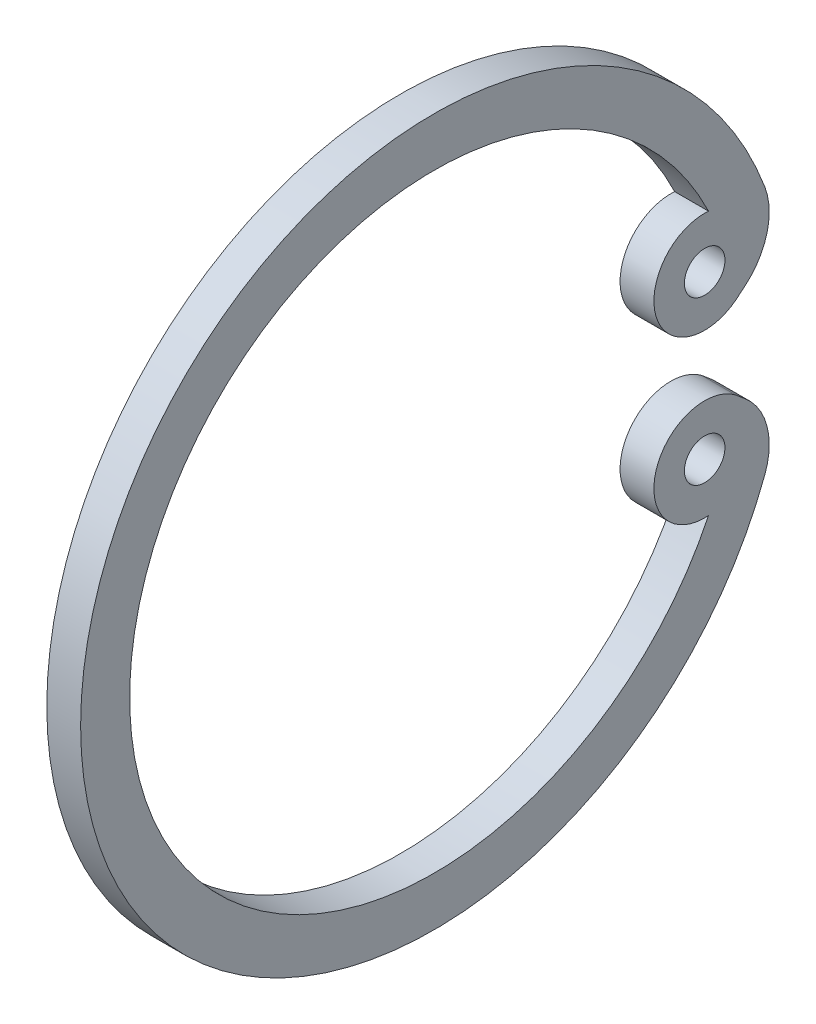
ISO-10303-21;
HEADER;
FILE_DESCRIPTION(('STEP AP214'),'2;1');
FILE_NAME('part.step','',(''),(''),'','','');
FILE_SCHEMA(('AUTOMOTIVE_DESIGN { 1 0 10303 214 1 1 1 1 }'));
ENDSEC;
DATA;
#1=APPLICATION_CONTEXT('core data for automotive mechanical design processes');
#2=APPLICATION_PROTOCOL_DEFINITION('international standard','automotive_design',2000,#1);
#3=PRODUCT_CONTEXT('',#1,'mechanical');
#4=PRODUCT('Part','Part','',(#3));
#5=PRODUCT_RELATED_PRODUCT_CATEGORY('part','',(#4));
#6=PRODUCT_DEFINITION_FORMATION('','',#4);
#7=PRODUCT_DEFINITION_CONTEXT('part definition',#1,'design');
#8=PRODUCT_DEFINITION('design','',#6,#7);
#9=PRODUCT_DEFINITION_SHAPE('','',#8);
#10=(LENGTH_UNIT() NAMED_UNIT(*) SI_UNIT(.MILLI.,.METRE.));
#11=(NAMED_UNIT(*) PLANE_ANGLE_UNIT() SI_UNIT($,.RADIAN.));
#12=(NAMED_UNIT(*) SI_UNIT($,.STERADIAN.) SOLID_ANGLE_UNIT());
#13=UNCERTAINTY_MEASURE_WITH_UNIT(LENGTH_MEASURE(1.E-05),#10,'distance_accuracy_value','');
#14=(GEOMETRIC_REPRESENTATION_CONTEXT(3) GLOBAL_UNCERTAINTY_ASSIGNED_CONTEXT((#13)) GLOBAL_UNIT_ASSIGNED_CONTEXT((#10,
#11,#12)) REPRESENTATION_CONTEXT('',''));
#15=CARTESIAN_POINT('',(0.,0.,0.));
#16=DIRECTION('',(0.,0.,1.));
#17=DIRECTION('',(1.,0.,0.));
#18=AXIS2_PLACEMENT_3D('',#15,#16,#17);
#19=CARTESIAN_POINT('',(18.3611111111111,-0.000162813210468626,9.93971753018335));
#20=DIRECTION('',(1.,0.,0.));
#21=DIRECTION('',(0.,0.,-1.));
#22=AXIS2_PLACEMENT_3D('',#19,#20,#21);
#23=CYLINDRICAL_SURFACE('',#22,2.5000000372529);
#24=CARTESIAN_POINT('',(18.6388888888889,-0.000162813210468626,9.93971753018335));
#25=DIRECTION('',(-1.,0.,0.));
#26=DIRECTION('',(0.,0.,1.));
#27=AXIS2_PLACEMENT_3D('',#24,#25,#26);
#28=CIRCLE('',#27,2.5000000372529);
#29=CARTESIAN_POINT('',(18.6388888888889,-1.08255334468496,7.68618010567962));
#30=VERTEX_POINT('',#29);
#31=CARTESIAN_POINT('',(18.6388888888889,1.08222771826402,7.68618010567962));
#32=VERTEX_POINT('',#31);
#33=EDGE_CURVE('E134',#30,#32,#28,.T.);
#34=ORIENTED_EDGE('',*,*,#33,.F.);
#35=DIRECTION('',(1.,0.,0.));
#36=VECTOR('',#35,1.);
#37=CARTESIAN_POINT('',(18.3611111111111,-1.08255334468496,7.68618010567962));
#38=LINE('',#37,#36);
#39=CARTESIAN_POINT('',(18.3611111111111,-1.08255334468496,7.68618010567962));
#40=VERTEX_POINT('',#39);
#41=EDGE_CURVE('E11',#40,#30,#38,.T.);
#42=ORIENTED_EDGE('',*,*,#41,.F.);
#43=CARTESIAN_POINT('',(18.3611111111111,-0.000162813210468626,9.93971753018335));
#44=DIRECTION('',(-1.,0.,0.));
#45=DIRECTION('',(0.,0.,1.));
#46=AXIS2_PLACEMENT_3D('',#43,#44,#45);
#47=CIRCLE('',#46,2.5000000372529);
#48=CARTESIAN_POINT('',(18.3611111111111,1.08222771826402,7.68618010567962));
#49=VERTEX_POINT('',#48);
#50=EDGE_CURVE('E155',#40,#49,#47,.T.);
#51=ORIENTED_EDGE('',*,*,#50,.T.);
#52=DIRECTION('',(1.,0.,0.));
#53=VECTOR('',#52,1.);
#54=CARTESIAN_POINT('',(18.3611111111111,1.08222771826402,7.68618010567962));
#55=LINE('',#54,#53);
#56=EDGE_CURVE('E40',#49,#32,#55,.T.);
#57=ORIENTED_EDGE('',*,*,#56,.T.);
#58=EDGE_LOOP('',(#34,#42,#51,#57));
#59=FACE_BOUND('',#58,.T.);
#60=ADVANCED_FACE('F37',(#59),#23,.F.);
#61=CARTESIAN_POINT('',(18.3611111111111,-0.666917459563021,7.71771885059295));
#62=DIRECTION('',(1.,0.,0.));
#63=DIRECTION('',(0.,0.,-1.));
#64=AXIS2_PLACEMENT_3D('',#61,#62,#63);
#65=CYLINDRICAL_SURFACE('',#64,0.416830758740048);
#66=CARTESIAN_POINT('',(18.6388888888889,-0.666917459563021,7.71771885059295));
#67=DIRECTION('',(1.,0.,0.));
#68=DIRECTION('',(0.,0.,-1.));
#69=AXIS2_PLACEMENT_3D('',#66,#67,#68);
#70=CIRCLE('',#69,0.416830758740048);
#71=CARTESIAN_POINT('',(18.6388888888889,-0.337229909778591,7.46266199232613));
#72=VERTEX_POINT('',#71);
#73=EDGE_CURVE('E153',#72,#30,#70,.T.);
#74=ORIENTED_EDGE('',*,*,#73,.F.);
#75=DIRECTION('',(1.,0.,0.));
#76=VECTOR('',#75,1.);
#77=CARTESIAN_POINT('',(18.3611111111111,-0.337229909778591,7.46266199232613));
#78=LINE('',#77,#76);
#79=CARTESIAN_POINT('',(18.3611111111111,-0.337229909778591,7.46266199232613));
#80=VERTEX_POINT('',#79);
#81=EDGE_CURVE('E46',#80,#72,#78,.T.);
#82=ORIENTED_EDGE('',*,*,#81,.F.);
#83=CARTESIAN_POINT('',(18.3611111111111,-0.666917459563021,7.71771885059295));
#84=DIRECTION('',(1.,0.,0.));
#85=DIRECTION('',(0.,0.,-1.));
#86=AXIS2_PLACEMENT_3D('',#83,#84,#85);
#87=CIRCLE('',#86,0.416830758740048);
#88=EDGE_CURVE('E124',#80,#40,#87,.T.);
#89=ORIENTED_EDGE('',*,*,#88,.T.);
#90=ORIENTED_EDGE('',*,*,#41,.T.);
#91=EDGE_LOOP('',(#74,#82,#89,#90));
#92=FACE_BOUND('',#91,.T.);
#93=ADVANCED_FACE('F167',(#92),#65,.T.);
#94=CARTESIAN_POINT('',(18.3611111111111,-0.401543008719923,7.38601662561192));
#95=DIRECTION('',(0.,0.766044443118982,-0.642787609686534));
#96=DIRECTION('',(0.,0.642787609686534,0.766044443118982));
#97=AXIS2_PLACEMENT_3D('',#94,#95,#96);
#98=PLANE('',#97);
#99=DIRECTION('',(0.,0.642787609686534,0.766044443118982));
#100=VECTOR('',#99,1.);
#101=CARTESIAN_POINT('',(18.6388888888889,-0.401543008719923,7.38601662561192));
#102=LINE('',#101,#100);
#103=CARTESIAN_POINT('',(18.6388888888889,-0.401543008719923,7.38601662561192));
#104=VERTEX_POINT('',#103);
#105=EDGE_CURVE('E111',#104,#72,#102,.T.);
#106=ORIENTED_EDGE('',*,*,#105,.F.);
#107=DIRECTION('',(1.,0.,0.));
#108=VECTOR('',#107,1.);
#109=CARTESIAN_POINT('',(18.3611111111111,-0.401543008719923,7.38601662561192));
#110=LINE('',#109,#108);
#111=CARTESIAN_POINT('',(18.3611111111111,-0.401543008719923,7.38601662561192));
#112=VERTEX_POINT('',#111);
#113=EDGE_CURVE('E106',#112,#104,#110,.T.);
#114=ORIENTED_EDGE('',*,*,#113,.F.);
#115=DIRECTION('',(0.,0.642787609686534,0.766044443118982));
#116=VECTOR('',#115,1.);
#117=CARTESIAN_POINT('',(18.3611111111111,-0.401543008719923,7.38601662561192));
#118=LINE('',#117,#116);
#119=EDGE_CURVE('E109',#112,#80,#118,.T.);
#120=ORIENTED_EDGE('',*,*,#119,.T.);
#121=ORIENTED_EDGE('',*,*,#81,.T.);
#122=EDGE_LOOP('',(#106,#114,#120,#121));
#123=FACE_BOUND('',#122,.T.);
#124=ADVANCED_FACE('F108',(#123),#98,.T.);
#125=CARTESIAN_POINT('',(18.3611111111111,-0.827123254897134,7.74312085321556));
#126=DIRECTION('',(1.,0.,0.));
#127=DIRECTION('',(0.,0.,-1.));
#128=AXIS2_PLACEMENT_3D('',#125,#126,#127);
#129=CYLINDRICAL_SURFACE('',#128,0.555555555555558);
#130=CARTESIAN_POINT('',(18.6388888888889,-0.827123254897134,7.74312085321556));
#131=DIRECTION('',(1.,0.,0.));
#132=DIRECTION('',(0.,0.,-1.));
#133=AXIS2_PLACEMENT_3D('',#130,#131,#132);
#134=CIRCLE('',#133,0.555555555555558);
#135=CARTESIAN_POINT('',(18.6388888888889,-1.02286333631576,7.22319028493276));
#136=VERTEX_POINT('',#135);
#137=EDGE_CURVE('E150',#136,#104,#134,.T.);
#138=ORIENTED_EDGE('',*,*,#137,.F.);
#139=DIRECTION('',(1.,0.,0.));
#140=VECTOR('',#139,1.);
#141=CARTESIAN_POINT('',(18.3611111111111,-1.02286333631576,7.22319028493276));
#142=LINE('',#141,#140);
#143=CARTESIAN_POINT('',(18.3611111111111,-1.02286333631576,7.22319028493276));
#144=VERTEX_POINT('',#143);
#145=EDGE_CURVE('E116',#144,#136,#142,.T.);
#146=ORIENTED_EDGE('',*,*,#145,.F.);
#147=CARTESIAN_POINT('',(18.3611111111111,-0.827123254897134,7.74312085321556));
#148=DIRECTION('',(1.,0.,0.));
#149=DIRECTION('',(0.,0.,-1.));
#150=AXIS2_PLACEMENT_3D('',#147,#148,#149);
#151=CIRCLE('',#150,0.555555555555558);
#152=EDGE_CURVE('E122',#144,#112,#151,.T.);
#153=ORIENTED_EDGE('',*,*,#152,.T.);
#154=ORIENTED_EDGE('',*,*,#113,.T.);
#155=EDGE_LOOP('',(#138,#146,#153,#154));
#156=FACE_BOUND('',#155,.T.);
#157=ADVANCED_FACE('F126',(#156),#129,.T.);
#158=CARTESIAN_POINT('',(18.3611111111111,-0.000162813210468626,9.93971753018335));
#159=DIRECTION('',(1.,0.,0.));
#160=DIRECTION('',(0.,0.,-1.));
#161=AXIS2_PLACEMENT_3D('',#158,#159,#160);
#162=CYLINDRICAL_SURFACE('',#161,2.90266026846901);
#163=CARTESIAN_POINT('',(18.6388888888889,-0.000162813210468626,9.93971753018335));
#164=DIRECTION('',(1.,0.,0.));
#165=DIRECTION('',(0.,0.,-1.));
#166=AXIS2_PLACEMENT_3D('',#163,#164,#165);
#167=CIRCLE('',#166,2.90266026846901);
#168=CARTESIAN_POINT('',(18.6388888888889,1.0225283518045,7.22318676187813));
#169=VERTEX_POINT('',#168);
#170=EDGE_CURVE('E147',#169,#136,#167,.T.);
#171=ORIENTED_EDGE('',*,*,#170,.F.);
#172=DIRECTION('',(1.,0.,0.));
#173=VECTOR('',#172,1.);
#174=CARTESIAN_POINT('',(18.3611111111111,1.0225283518045,7.22318676187813));
#175=LINE('',#174,#173);
#176=CARTESIAN_POINT('',(18.3611111111111,1.0225283518045,7.22318676187813));
#177=VERTEX_POINT('',#176);
#178=EDGE_CURVE('E159',#177,#169,#175,.T.);
#179=ORIENTED_EDGE('',*,*,#178,.F.);
#180=CARTESIAN_POINT('',(18.3611111111111,-0.000162813210468626,9.93971753018335));
#181=DIRECTION('',(1.,0.,0.));
#182=DIRECTION('',(0.,0.,-1.));
#183=AXIS2_PLACEMENT_3D('',#180,#181,#182);
#184=CIRCLE('',#183,2.90266026846901);
#185=EDGE_CURVE('E127',#177,#144,#184,.T.);
#186=ORIENTED_EDGE('',*,*,#185,.T.);
#187=ORIENTED_EDGE('',*,*,#145,.T.);
#188=EDGE_LOOP('',(#171,#179,#186,#187));
#189=FACE_BOUND('',#188,.T.);
#190=ADVANCED_FACE('F180',(#189),#162,.T.);
#191=CARTESIAN_POINT('',(18.3611111111111,0.826790061480457,7.74311800445706));
#192=DIRECTION('',(1.,0.,0.));
#193=DIRECTION('',(0.,0.,-1.));
#194=AXIS2_PLACEMENT_3D('',#191,#192,#193);
#195=CYLINDRICAL_SURFACE('',#194,0.555555555555555);
#196=CARTESIAN_POINT('',(18.6388888888889,0.826790061480457,7.74311800445706));
#197=DIRECTION('',(1.,0.,0.));
#198=DIRECTION('',(0.,0.,-1.));
#199=AXIS2_PLACEMENT_3D('',#196,#197,#198);
#200=CIRCLE('',#199,0.555555555555555);
#201=CARTESIAN_POINT('',(18.6388888888889,0.401209815303247,7.38601377685343));
#202=VERTEX_POINT('',#201);
#203=EDGE_CURVE('E144',#202,#169,#200,.T.);
#204=ORIENTED_EDGE('',*,*,#203,.F.);
#205=DIRECTION('',(1.,0.,0.));
#206=VECTOR('',#205,1.);
#207=CARTESIAN_POINT('',(18.3611111111111,0.401209815303247,7.38601377685343));
#208=LINE('',#207,#206);
#209=CARTESIAN_POINT('',(18.3611111111111,0.401209815303247,7.38601377685343));
#210=VERTEX_POINT('',#209);
#211=EDGE_CURVE('E161',#210,#202,#208,.T.);
#212=ORIENTED_EDGE('',*,*,#211,.F.);
#213=CARTESIAN_POINT('',(18.3611111111111,0.826790061480457,7.74311800445706));
#214=DIRECTION('',(1.,0.,0.));
#215=DIRECTION('',(0.,0.,-1.));
#216=AXIS2_PLACEMENT_3D('',#213,#214,#215);
#217=CIRCLE('',#216,0.555555555555555);
#218=EDGE_CURVE('E129',#210,#177,#217,.T.);
#219=ORIENTED_EDGE('',*,*,#218,.T.);
#220=ORIENTED_EDGE('',*,*,#178,.T.);
#221=EDGE_LOOP('',(#204,#212,#219,#220));
#222=FACE_BOUND('',#221,.T.);
#223=ADVANCED_FACE('F183',(#222),#195,.T.);
#224=CARTESIAN_POINT('',(18.3611111111111,0.337156289867929,7.46285995798236));
#225=DIRECTION('',(0.,-0.768147331821205,-0.640273126576435));
#226=DIRECTION('',(0.,0.640273126576435,-0.768147331821205));
#227=AXIS2_PLACEMENT_3D('',#224,#225,#226);
#228=PLANE('',#227);
#229=DIRECTION('',(0.,0.640273126576435,-0.768147331821205));
#230=VECTOR('',#229,1.);
#231=CARTESIAN_POINT('',(18.6388888888889,0.337156289867929,7.46285995798236));
#232=LINE('',#231,#230);
#233=CARTESIAN_POINT('',(18.6388888888889,0.337156289867929,7.46285995798236));
#234=VERTEX_POINT('',#233);
#235=EDGE_CURVE('E141',#234,#202,#232,.T.);
#236=ORIENTED_EDGE('',*,*,#235,.F.);
#237=DIRECTION('',(1.,0.,0.));
#238=VECTOR('',#237,1.);
#239=CARTESIAN_POINT('',(18.3611111111111,0.337156289867929,7.46285995798236));
#240=LINE('',#239,#238);
#241=CARTESIAN_POINT('',(18.3611111111111,0.337156289867929,7.46285995798236));
#242=VERTEX_POINT('',#241);
#243=EDGE_CURVE('E162',#242,#234,#240,.T.);
#244=ORIENTED_EDGE('',*,*,#243,.F.);
#245=DIRECTION('',(0.,0.640273126576435,-0.768147331821205));
#246=VECTOR('',#245,1.);
#247=CARTESIAN_POINT('',(18.3611111111111,0.337156289867929,7.46285995798236));
#248=LINE('',#247,#246);
#249=EDGE_CURVE('E229',#242,#210,#248,.T.);
#250=ORIENTED_EDGE('',*,*,#249,.T.);
#251=ORIENTED_EDGE('',*,*,#211,.T.);
#252=EDGE_LOOP('',(#236,#244,#250,#251));
#253=FACE_BOUND('',#252,.T.);
#254=ADVANCED_FACE('F187',(#253),#228,.T.);
#255=CARTESIAN_POINT('',(18.3611111111111,0.666759358402729,7.71775783620726));
#256=DIRECTION('',(1.,0.,0.));
#257=DIRECTION('',(0.,0.,-1.));
#258=AXIS2_PLACEMENT_3D('',#255,#256,#257);
#259=CYLINDRICAL_SURFACE('',#258,0.416666666666666);
#260=CARTESIAN_POINT('',(18.6388888888889,0.666759358402729,7.71775783620726));
#261=DIRECTION('',(1.,0.,0.));
#262=DIRECTION('',(0.,0.,-1.));
#263=AXIS2_PLACEMENT_3D('',#260,#261,#262);
#264=CIRCLE('',#263,0.416666666666666);
#265=EDGE_CURVE('E137',#32,#234,#264,.T.);
#266=ORIENTED_EDGE('',*,*,#265,.F.);
#267=ORIENTED_EDGE('',*,*,#56,.F.);
#268=CARTESIAN_POINT('',(18.3611111111111,0.666759358402729,7.71775783620726));
#269=DIRECTION('',(1.,0.,0.));
#270=DIRECTION('',(0.,0.,-1.));
#271=AXIS2_PLACEMENT_3D('',#268,#269,#270);
#272=CIRCLE('',#271,0.416666666666666);
#273=EDGE_CURVE('E227',#49,#242,#272,.T.);
#274=ORIENTED_EDGE('',*,*,#273,.T.);
#275=ORIENTED_EDGE('',*,*,#243,.T.);
#276=EDGE_LOOP('',(#266,#267,#274,#275));
#277=FACE_BOUND('',#276,.T.);
#278=ADVANCED_FACE('F164',(#277),#259,.T.);
#279=CARTESIAN_POINT('',(18.3611111111111,-0.000162813210468626,9.93971753018335));
#280=DIRECTION('',(-1.,0.,0.));
#281=DIRECTION('',(0.,0.,1.));
#282=AXIS2_PLACEMENT_3D('',#279,#280,#281);
#283=PLANE('',#282);
#284=CARTESIAN_POINT('',(18.3611111111111,0.66653768838861,7.71760813916771));
#285=DIRECTION('',(1.,0.,0.));
#286=DIRECTION('',(0.,0.,1.));
#287=AXIS2_PLACEMENT_3D('',#284,#285,#286);
#288=CIRCLE('',#287,0.166666666666667);
#289=CARTESIAN_POINT('',(18.3611111111111,0.66653768838861,7.88427480583437));
#290=VERTEX_POINT('',#289);
#291=EDGE_CURVE('E214',#290,#290,#288,.T.);
#292=ORIENTED_EDGE('',*,*,#291,.T.);
#293=EDGE_LOOP('',(#292));
#294=FACE_BOUND('',#293,.T.);
#295=CARTESIAN_POINT('',(18.3611111111111,-0.666795644944723,7.71760813916771));
#296=DIRECTION('',(1.,0.,0.));
#297=DIRECTION('',(0.,0.,1.));
#298=AXIS2_PLACEMENT_3D('',#295,#296,#297);
#299=CIRCLE('',#298,0.166666666666667);
#300=CARTESIAN_POINT('',(18.3611111111111,-0.666795644944723,7.88427480583437));
#301=VERTEX_POINT('',#300);
#302=EDGE_CURVE('E138',#301,#301,#299,.T.);
#303=ORIENTED_EDGE('',*,*,#302,.T.);
#304=EDGE_LOOP('',(#303));
#305=FACE_BOUND('',#304,.T.);
#306=ORIENTED_EDGE('',*,*,#50,.F.);
#307=ORIENTED_EDGE('',*,*,#88,.F.);
#308=ORIENTED_EDGE('',*,*,#119,.F.);
#309=ORIENTED_EDGE('',*,*,#152,.F.);
#310=ORIENTED_EDGE('',*,*,#185,.F.);
#311=ORIENTED_EDGE('',*,*,#218,.F.);
#312=ORIENTED_EDGE('',*,*,#249,.F.);
#313=ORIENTED_EDGE('',*,*,#273,.F.);
#314=EDGE_LOOP('',(#306,#307,#308,#309,#310,#311,#312,#313));
#315=FACE_BOUND('',#314,.T.);
#316=ADVANCED_FACE('F120',(#294,#305,#315),#283,.T.);
#317=CARTESIAN_POINT('',(18.6388888888889,-0.000162813210468626,9.93971753018335));
#318=DIRECTION('',(-1.,0.,0.));
#319=DIRECTION('',(0.,0.,1.));
#320=AXIS2_PLACEMENT_3D('',#317,#318,#319);
#321=PLANE('',#320);
#322=CARTESIAN_POINT('',(18.6388888888889,0.66653768838861,7.71760813916771));
#323=DIRECTION('',(1.,0.,0.));
#324=DIRECTION('',(0.,0.,1.));
#325=AXIS2_PLACEMENT_3D('',#322,#323,#324);
#326=CIRCLE('',#325,0.166666666666667);
#327=CARTESIAN_POINT('',(18.6388888888889,0.66653768838861,7.88427480583437));
#328=VERTEX_POINT('',#327);
#329=EDGE_CURVE('E217',#328,#328,#326,.T.);
#330=ORIENTED_EDGE('',*,*,#329,.F.);
#331=EDGE_LOOP('',(#330));
#332=FACE_BOUND('',#331,.T.);
#333=CARTESIAN_POINT('',(18.6388888888889,-0.666795644944723,7.71760813916771));
#334=DIRECTION('',(1.,0.,0.));
#335=DIRECTION('',(0.,0.,1.));
#336=AXIS2_PLACEMENT_3D('',#333,#334,#335);
#337=CIRCLE('',#336,0.166666666666667);
#338=CARTESIAN_POINT('',(18.6388888888889,-0.666795644944723,7.88427480583437));
#339=VERTEX_POINT('',#338);
#340=EDGE_CURVE('E219',#339,#339,#337,.T.);
#341=ORIENTED_EDGE('',*,*,#340,.F.);
#342=EDGE_LOOP('',(#341));
#343=FACE_BOUND('',#342,.T.);
#344=ORIENTED_EDGE('',*,*,#33,.T.);
#345=ORIENTED_EDGE('',*,*,#265,.T.);
#346=ORIENTED_EDGE('',*,*,#235,.T.);
#347=ORIENTED_EDGE('',*,*,#203,.T.);
#348=ORIENTED_EDGE('',*,*,#170,.T.);
#349=ORIENTED_EDGE('',*,*,#137,.T.);
#350=ORIENTED_EDGE('',*,*,#105,.T.);
#351=ORIENTED_EDGE('',*,*,#73,.T.);
#352=EDGE_LOOP('',(#344,#345,#346,#347,#348,#349,#350,#351));
#353=FACE_BOUND('',#352,.T.);
#354=ADVANCED_FACE('F166',(#332,#343,#353),#321,.F.);
#355=CARTESIAN_POINT('',(18.3611111111111,-0.666795644944723,7.71760813916771));
#356=DIRECTION('',(1.,0.,0.));
#357=DIRECTION('',(0.,0.,-1.));
#358=AXIS2_PLACEMENT_3D('',#355,#356,#357);
#359=CYLINDRICAL_SURFACE('',#358,0.166666666666667);
#360=ORIENTED_EDGE('',*,*,#302,.F.);
#361=EDGE_LOOP('',(#360));
#362=FACE_BOUND('',#361,.T.);
#363=ORIENTED_EDGE('',*,*,#340,.T.);
#364=EDGE_LOOP('',(#363));
#365=FACE_BOUND('',#364,.T.);
#366=ADVANCED_FACE('F199',(#362,#365),#359,.F.);
#367=CARTESIAN_POINT('',(18.3611111111111,0.66653768838861,7.71760813916771));
#368=DIRECTION('',(1.,0.,0.));
#369=DIRECTION('',(0.,0.,-1.));
#370=AXIS2_PLACEMENT_3D('',#367,#368,#369);
#371=CYLINDRICAL_SURFACE('',#370,0.166666666666667);
#372=ORIENTED_EDGE('',*,*,#291,.F.);
#373=EDGE_LOOP('',(#372));
#374=FACE_BOUND('',#373,.T.);
#375=ORIENTED_EDGE('',*,*,#329,.T.);
#376=EDGE_LOOP('',(#375));
#377=FACE_BOUND('',#376,.T.);
#378=ADVANCED_FACE('F206',(#374,#377),#371,.F.);
#379=CLOSED_SHELL('',(#60,#93,#124,#157,#190,#223,#254,#278,#316,#354,#366,#378));
#380=MANIFOLD_SOLID_BREP('B2',#379);
#381=ADVANCED_BREP_SHAPE_REPRESENTATION('',(#18,#380),#14);
#382=SHAPE_DEFINITION_REPRESENTATION(#9,#381);
ENDSEC;
END-ISO-10303-21;
